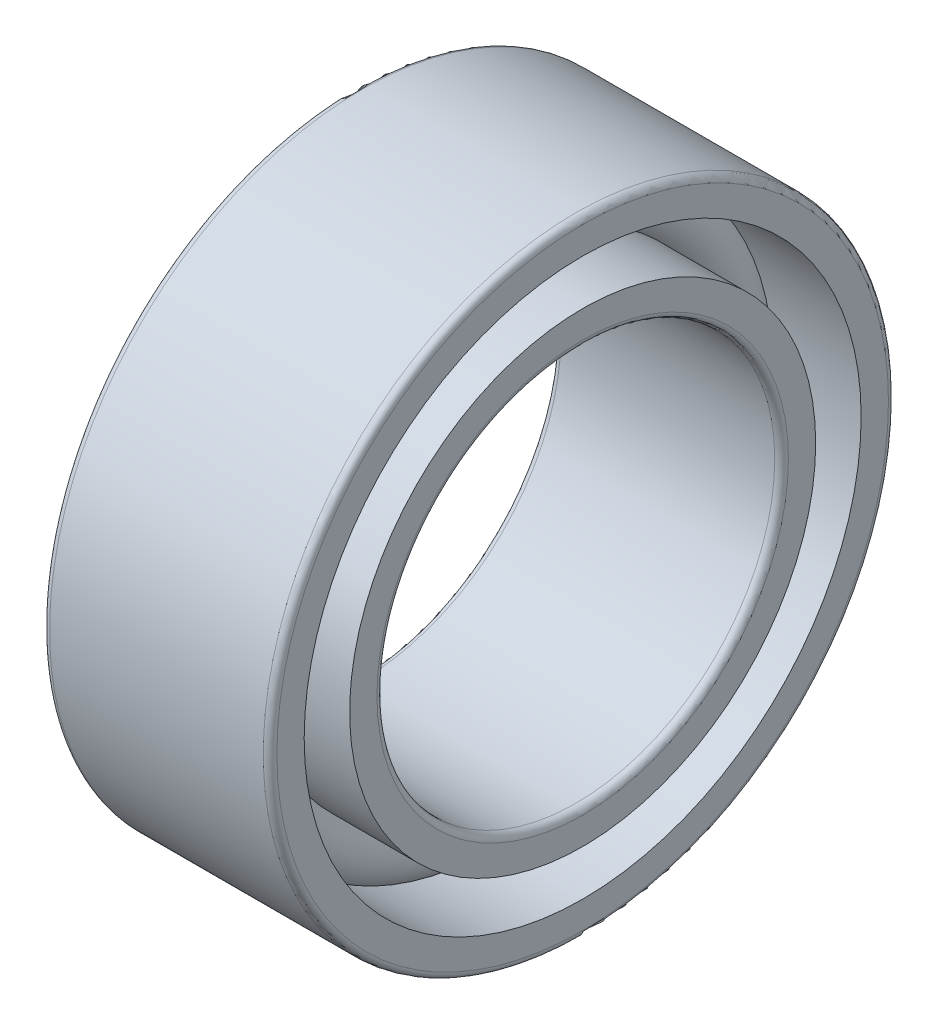
ISO-10303-21;
HEADER;
FILE_DESCRIPTION(('STEP AP214'),'2;1');
FILE_NAME('part.step','',(''),(''),'','','');
FILE_SCHEMA(('AUTOMOTIVE_DESIGN { 1 0 10303 214 1 1 1 1 }'));
ENDSEC;
DATA;
#1=APPLICATION_CONTEXT('core data for automotive mechanical design processes');
#2=APPLICATION_PROTOCOL_DEFINITION('international standard','automotive_design',2000,#1);
#3=PRODUCT_CONTEXT('',#1,'mechanical');
#4=PRODUCT('Part','Part','',(#3));
#5=PRODUCT_RELATED_PRODUCT_CATEGORY('part','',(#4));
#6=PRODUCT_DEFINITION_FORMATION('','',#4);
#7=PRODUCT_DEFINITION_CONTEXT('part definition',#1,'design');
#8=PRODUCT_DEFINITION('design','',#6,#7);
#9=PRODUCT_DEFINITION_SHAPE('','',#8);
#10=(LENGTH_UNIT() NAMED_UNIT(*) SI_UNIT(.MILLI.,.METRE.));
#11=(NAMED_UNIT(*) PLANE_ANGLE_UNIT() SI_UNIT($,.RADIAN.));
#12=(NAMED_UNIT(*) SI_UNIT($,.STERADIAN.) SOLID_ANGLE_UNIT());
#13=UNCERTAINTY_MEASURE_WITH_UNIT(LENGTH_MEASURE(1.E-05),#10,'distance_accuracy_value','');
#14=(GEOMETRIC_REPRESENTATION_CONTEXT(3) GLOBAL_UNCERTAINTY_ASSIGNED_CONTEXT((#13)) GLOBAL_UNIT_ASSIGNED_CONTEXT((#10,
#11,#12)) REPRESENTATION_CONTEXT('',''));
#15=CARTESIAN_POINT('',(0.,0.,0.));
#16=DIRECTION('',(0.,0.,1.));
#17=DIRECTION('',(1.,0.,0.));
#18=AXIS2_PLACEMENT_3D('',#15,#16,#17);
#19=CARTESIAN_POINT('',(-71.7913299491705,33.0370897872859,-24.0443986058399));
#20=DIRECTION('',(-1.,0.,0.));
#21=DIRECTION('',(0.,0.,1.));
#22=AXIS2_PLACEMENT_3D('',#19,#20,#21);
#23=TOROIDAL_SURFACE('',#22,22.5,3.);
#24=CARTESIAN_POINT('',(-69.5552619716707,33.0370897872859,-24.0443986058399));
#25=DIRECTION('',(-1.,0.,0.));
#26=DIRECTION('',(0.,0.,1.));
#27=AXIS2_PLACEMENT_3D('',#24,#25,#26);
#28=CIRCLE('',#27,24.5);
#29=CARTESIAN_POINT('',(-69.5552619716707,33.0370897872859,0.455601394160118));
#30=VERTEX_POINT('',#29);
#31=EDGE_CURVE('E39',#30,#30,#28,.F.);
#32=ORIENTED_EDGE('',*,*,#31,.T.);
#33=EDGE_LOOP('',(#32));
#34=FACE_BOUND('',#33,.T.);
#35=CARTESIAN_POINT('',(-69.5552619716707,33.0370897872859,-24.0443986058399));
#36=DIRECTION('',(-1.,0.,0.));
#37=DIRECTION('',(0.,0.,1.));
#38=AXIS2_PLACEMENT_3D('',#35,#36,#37);
#39=CIRCLE('',#38,20.5);
#40=CARTESIAN_POINT('',(-69.5552619716707,33.0370897872859,-3.54439860583988));
#41=VERTEX_POINT('',#40);
#42=EDGE_CURVE('E10',#41,#41,#39,.T.);
#43=ORIENTED_EDGE('',*,*,#42,.T.);
#44=EDGE_LOOP('',(#43));
#45=FACE_BOUND('',#44,.T.);
#46=ADVANCED_FACE('F35',(#34,#45),#23,.T.);
#47=CARTESIAN_POINT('',(-92.4288299491705,33.0370897872859,-24.0443986058399));
#48=DIRECTION('',(1.,0.,0.));
#49=DIRECTION('',(0.,0.,-1.));
#50=AXIS2_PLACEMENT_3D('',#47,#48,#49);
#51=CYLINDRICAL_SURFACE('',#50,20.5);
#52=CARTESIAN_POINT('',(-61.7913299491705,33.0370897872859,-24.0443986058399));
#53=DIRECTION('',(1.,0.,0.));
#54=DIRECTION('',(0.,0.,-1.));
#55=AXIS2_PLACEMENT_3D('',#52,#53,#54);
#56=CIRCLE('',#55,20.5);
#57=CARTESIAN_POINT('',(-61.7913299491705,33.0370897872859,-44.5443986058399));
#58=VERTEX_POINT('',#57);
#59=EDGE_CURVE('E48',#58,#58,#56,.T.);
#60=ORIENTED_EDGE('',*,*,#59,.F.);
#61=EDGE_LOOP('',(#60));
#62=FACE_BOUND('',#61,.T.);
#63=ORIENTED_EDGE('',*,*,#42,.F.);
#64=EDGE_LOOP('',(#63));
#65=FACE_BOUND('',#64,.T.);
#66=ADVANCED_FACE('F87',(#62,#65),#51,.T.);
#67=CARTESIAN_POINT('',(-92.4288299491705,33.0370897872859,-24.0443986058399));
#68=DIRECTION('',(1.,0.,0.));
#69=DIRECTION('',(0.,0.,-1.));
#70=AXIS2_PLACEMENT_3D('',#67,#68,#69);
#71=CYLINDRICAL_SURFACE('',#70,20.5);
#72=CARTESIAN_POINT('',(-81.7913299491705,33.0370897872859,-24.0443986058399));
#73=DIRECTION('',(1.,0.,0.));
#74=DIRECTION('',(0.,0.,-1.));
#75=AXIS2_PLACEMENT_3D('',#72,#73,#74);
#76=CIRCLE('',#75,20.5);
#77=CARTESIAN_POINT('',(-81.7913299491705,33.0370897872859,-44.5443986058399));
#78=VERTEX_POINT('',#77);
#79=EDGE_CURVE('E57',#78,#78,#76,.T.);
#80=ORIENTED_EDGE('',*,*,#79,.T.);
#81=EDGE_LOOP('',(#80));
#82=FACE_BOUND('',#81,.T.);
#83=CARTESIAN_POINT('',(-74.0273979266703,33.0370897872859,-24.0443986058399));
#84=DIRECTION('',(1.,0.,0.));
#85=DIRECTION('',(0.,0.,-1.));
#86=AXIS2_PLACEMENT_3D('',#83,#84,#85);
#87=CIRCLE('',#86,20.5);
#88=CARTESIAN_POINT('',(-74.0273979266703,33.0370897872859,-44.5443986058399));
#89=VERTEX_POINT('',#88);
#90=EDGE_CURVE('E43',#89,#89,#87,.T.);
#91=ORIENTED_EDGE('',*,*,#90,.F.);
#92=EDGE_LOOP('',(#91));
#93=FACE_BOUND('',#92,.T.);
#94=ADVANCED_FACE('F90',(#82,#93),#71,.T.);
#95=CARTESIAN_POINT('',(-61.7913299491705,51.1370897872859,-24.0443986058399));
#96=DIRECTION('',(1.,0.,0.));
#97=DIRECTION('',(0.,0.,-1.));
#98=AXIS2_PLACEMENT_3D('',#95,#96,#97);
#99=PLANE('',#98);
#100=ORIENTED_EDGE('',*,*,#59,.T.);
#101=EDGE_LOOP('',(#100));
#102=FACE_BOUND('',#101,.T.);
#103=CARTESIAN_POINT('',(-61.7913299491705,33.0370897872859,-24.0443986058399));
#104=DIRECTION('',(1.,0.,0.));
#105=DIRECTION('',(0.,0.,-1.));
#106=AXIS2_PLACEMENT_3D('',#103,#104,#105);
#107=CIRCLE('',#106,18.1);
#108=CARTESIAN_POINT('',(-61.7913299491705,33.0370897872859,-42.1443986058399));
#109=VERTEX_POINT('',#108);
#110=EDGE_CURVE('E79',#109,#109,#107,.T.);
#111=ORIENTED_EDGE('',*,*,#110,.F.);
#112=EDGE_LOOP('',(#111));
#113=FACE_BOUND('',#112,.T.);
#114=ADVANCED_FACE('F84',(#102,#113),#99,.T.);
#115=CARTESIAN_POINT('',(-62.3913299491705,33.0370897872859,-24.0443986058399));
#116=DIRECTION('',(1.,0.,0.));
#117=DIRECTION('',(0.,0.,-1.));
#118=AXIS2_PLACEMENT_3D('',#115,#116,#117);
#119=TOROIDAL_SURFACE('',#118,18.1,0.6);
#120=ORIENTED_EDGE('',*,*,#110,.T.);
#121=EDGE_LOOP('',(#120));
#122=FACE_BOUND('',#121,.T.);
#123=CARTESIAN_POINT('',(-62.3913299491705,33.0370897872859,-24.0443986058399));
#124=DIRECTION('',(1.,0.,0.));
#125=DIRECTION('',(0.,0.,-1.));
#126=AXIS2_PLACEMENT_3D('',#123,#124,#125);
#127=CIRCLE('',#126,17.5);
#128=CARTESIAN_POINT('',(-62.3913299491705,33.0370897872859,-41.5443986058399));
#129=VERTEX_POINT('',#128);
#130=EDGE_CURVE('E76',#129,#129,#127,.T.);
#131=ORIENTED_EDGE('',*,*,#130,.F.);
#132=EDGE_LOOP('',(#131));
#133=FACE_BOUND('',#132,.T.);
#134=ADVANCED_FACE('F101',(#122,#133),#119,.T.);
#135=CARTESIAN_POINT('',(-92.4288299491705,33.0370897872859,-24.0443986058399));
#136=DIRECTION('',(1.,0.,0.));
#137=DIRECTION('',(0.,0.,-1.));
#138=AXIS2_PLACEMENT_3D('',#135,#136,#137);
#139=CYLINDRICAL_SURFACE('',#138,17.5);
#140=ORIENTED_EDGE('',*,*,#130,.T.);
#141=EDGE_LOOP('',(#140));
#142=FACE_BOUND('',#141,.T.);
#143=CARTESIAN_POINT('',(-81.1913299491705,33.0370897872859,-24.0443986058399));
#144=DIRECTION('',(1.,0.,0.));
#145=DIRECTION('',(0.,0.,-1.));
#146=AXIS2_PLACEMENT_3D('',#143,#144,#145);
#147=CIRCLE('',#146,17.5);
#148=CARTESIAN_POINT('',(-81.1913299491705,33.0370897872859,-41.5443986058399));
#149=VERTEX_POINT('',#148);
#150=EDGE_CURVE('E73',#149,#149,#147,.T.);
#151=ORIENTED_EDGE('',*,*,#150,.F.);
#152=EDGE_LOOP('',(#151));
#153=FACE_BOUND('',#152,.T.);
#154=ADVANCED_FACE('F104',(#142,#153),#139,.F.);
#155=CARTESIAN_POINT('',(-81.1913299491705,33.0370897872859,-24.0443986058399));
#156=DIRECTION('',(1.,0.,0.));
#157=DIRECTION('',(0.,0.,-1.));
#158=AXIS2_PLACEMENT_3D('',#155,#156,#157);
#159=TOROIDAL_SURFACE('',#158,18.1,0.6);
#160=ORIENTED_EDGE('',*,*,#150,.T.);
#161=EDGE_LOOP('',(#160));
#162=FACE_BOUND('',#161,.T.);
#163=CARTESIAN_POINT('',(-81.7913299491705,33.0370897872859,-24.0443986058399));
#164=DIRECTION('',(1.,0.,0.));
#165=DIRECTION('',(0.,0.,-1.));
#166=AXIS2_PLACEMENT_3D('',#163,#164,#165);
#167=CIRCLE('',#166,18.1);
#168=CARTESIAN_POINT('',(-81.7913299491705,33.0370897872859,-42.1443986058399));
#169=VERTEX_POINT('',#168);
#170=EDGE_CURVE('E70',#169,#169,#167,.T.);
#171=ORIENTED_EDGE('',*,*,#170,.F.);
#172=EDGE_LOOP('',(#171));
#173=FACE_BOUND('',#172,.T.);
#174=ADVANCED_FACE('F108',(#162,#173),#159,.T.);
#175=CARTESIAN_POINT('',(-81.7913299491705,53.5370897872859,-24.0443986058399));
#176=DIRECTION('',(-1.,0.,0.));
#177=DIRECTION('',(0.,0.,1.));
#178=AXIS2_PLACEMENT_3D('',#175,#176,#177);
#179=PLANE('',#178);
#180=ORIENTED_EDGE('',*,*,#170,.T.);
#181=EDGE_LOOP('',(#180));
#182=FACE_BOUND('',#181,.T.);
#183=ORIENTED_EDGE('',*,*,#79,.F.);
#184=EDGE_LOOP('',(#183));
#185=FACE_BOUND('',#184,.T.);
#186=ADVANCED_FACE('F112',(#182,#185),#179,.T.);
#187=CARTESIAN_POINT('',(-74.0273979266703,33.0370897872859,-24.0443986058399));
#188=DIRECTION('',(1.,0.,0.));
#189=DIRECTION('',(0.,0.,-1.));
#190=AXIS2_PLACEMENT_3D('',#187,#188,#189);
#191=CIRCLE('',#190,24.5);
#192=CARTESIAN_POINT('',(-74.0273979266703,33.0370897872859,-48.5443986058399));
#193=VERTEX_POINT('',#192);
#194=EDGE_CURVE('E51',#193,#193,#191,.F.);
#195=ORIENTED_EDGE('',*,*,#194,.T.);
#196=EDGE_LOOP('',(#195));
#197=FACE_BOUND('',#196,.T.);
#198=ORIENTED_EDGE('',*,*,#90,.T.);
#199=EDGE_LOOP('',(#198));
#200=FACE_BOUND('',#199,.T.);
#201=ADVANCED_FACE('F37',(#197,#200),#23,.T.);
#202=CARTESIAN_POINT('',(-92.4288299491705,33.0370897872859,-24.0443986058399));
#203=DIRECTION('',(1.,0.,0.));
#204=DIRECTION('',(0.,0.,-1.));
#205=AXIS2_PLACEMENT_3D('',#202,#203,#204);
#206=CYLINDRICAL_SURFACE('',#205,24.5);
#207=CARTESIAN_POINT('',(-61.7913299491705,33.0370897872859,-24.0443986058399));
#208=DIRECTION('',(1.,0.,0.));
#209=DIRECTION('',(0.,0.,-1.));
#210=AXIS2_PLACEMENT_3D('',#207,#208,#209);
#211=CIRCLE('',#210,24.5);
#212=CARTESIAN_POINT('',(-61.7913299491705,33.0370897872859,-48.5443986058399));
#213=VERTEX_POINT('',#212);
#214=EDGE_CURVE('E53',#213,#213,#211,.T.);
#215=ORIENTED_EDGE('',*,*,#214,.T.);
#216=EDGE_LOOP('',(#215));
#217=FACE_BOUND('',#216,.T.);
#218=ORIENTED_EDGE('',*,*,#31,.F.);
#219=EDGE_LOOP('',(#218));
#220=FACE_BOUND('',#219,.T.);
#221=ADVANCED_FACE('F117',(#217,#220),#206,.F.);
#222=CARTESIAN_POINT('',(-92.4288299491705,33.0370897872859,-24.0443986058399));
#223=DIRECTION('',(1.,0.,0.));
#224=DIRECTION('',(0.,0.,-1.));
#225=AXIS2_PLACEMENT_3D('',#222,#223,#224);
#226=CYLINDRICAL_SURFACE('',#225,24.5);
#227=CARTESIAN_POINT('',(-81.7913299491705,33.0370897872859,-24.0443986058399));
#228=DIRECTION('',(1.,0.,0.));
#229=DIRECTION('',(0.,0.,-1.));
#230=AXIS2_PLACEMENT_3D('',#227,#228,#229);
#231=CIRCLE('',#230,24.5);
#232=CARTESIAN_POINT('',(-81.7913299491705,33.0370897872859,-48.5443986058399));
#233=VERTEX_POINT('',#232);
#234=EDGE_CURVE('E148',#233,#233,#231,.T.);
#235=ORIENTED_EDGE('',*,*,#234,.F.);
#236=EDGE_LOOP('',(#235));
#237=FACE_BOUND('',#236,.T.);
#238=ORIENTED_EDGE('',*,*,#194,.F.);
#239=EDGE_LOOP('',(#238));
#240=FACE_BOUND('',#239,.T.);
#241=ADVANCED_FACE('F120',(#237,#240),#226,.F.);
#242=CARTESIAN_POINT('',(-61.7913299491705,59.9370897872859,-24.0443986058399));
#243=DIRECTION('',(1.,0.,0.));
#244=DIRECTION('',(0.,0.,-1.));
#245=AXIS2_PLACEMENT_3D('',#242,#243,#244);
#246=PLANE('',#245);
#247=CARTESIAN_POINT('',(-61.7913299491705,33.0370897872859,-24.0443986058399));
#248=DIRECTION('',(1.,0.,0.));
#249=DIRECTION('',(0.,0.,-1.));
#250=AXIS2_PLACEMENT_3D('',#247,#248,#249);
#251=CIRCLE('',#250,26.9);
#252=CARTESIAN_POINT('',(-61.7913299491705,33.0370897872859,-50.9443986058399));
#253=VERTEX_POINT('',#252);
#254=EDGE_CURVE('E59',#253,#253,#251,.T.);
#255=ORIENTED_EDGE('',*,*,#254,.T.);
#256=EDGE_LOOP('',(#255));
#257=FACE_BOUND('',#256,.T.);
#258=ORIENTED_EDGE('',*,*,#214,.F.);
#259=EDGE_LOOP('',(#258));
#260=FACE_BOUND('',#259,.T.);
#261=ADVANCED_FACE('F121',(#257,#260),#246,.T.);
#262=CARTESIAN_POINT('',(-62.3913299491705,33.0370897872859,-24.0443986058399));
#263=DIRECTION('',(1.,0.,0.));
#264=DIRECTION('',(0.,0.,-1.));
#265=AXIS2_PLACEMENT_3D('',#262,#263,#264);
#266=TOROIDAL_SURFACE('',#265,26.9,0.599999999999997);
#267=CARTESIAN_POINT('',(-62.3913299491705,33.0370897872859,-24.0443986058399));
#268=DIRECTION('',(1.,0.,0.));
#269=DIRECTION('',(0.,0.,-1.));
#270=AXIS2_PLACEMENT_3D('',#267,#268,#269);
#271=CIRCLE('',#270,27.5);
#272=CARTESIAN_POINT('',(-62.3913299491705,33.0370897872859,-51.5443986058399));
#273=VERTEX_POINT('',#272);
#274=EDGE_CURVE('E64',#273,#273,#271,.T.);
#275=ORIENTED_EDGE('',*,*,#274,.T.);
#276=EDGE_LOOP('',(#275));
#277=FACE_BOUND('',#276,.T.);
#278=ORIENTED_EDGE('',*,*,#254,.F.);
#279=EDGE_LOOP('',(#278));
#280=FACE_BOUND('',#279,.T.);
#281=ADVANCED_FACE('F124',(#277,#280),#266,.T.);
#282=CARTESIAN_POINT('',(-92.4288299491705,33.0370897872859,-24.0443986058399));
#283=DIRECTION('',(1.,0.,0.));
#284=DIRECTION('',(0.,0.,-1.));
#285=AXIS2_PLACEMENT_3D('',#282,#283,#284);
#286=CYLINDRICAL_SURFACE('',#285,27.5);
#287=CARTESIAN_POINT('',(-81.1913299491705,33.0370897872859,-24.0443986058399));
#288=DIRECTION('',(1.,0.,0.));
#289=DIRECTION('',(0.,0.,-1.));
#290=AXIS2_PLACEMENT_3D('',#287,#288,#289);
#291=CIRCLE('',#290,27.5);
#292=CARTESIAN_POINT('',(-81.1913299491705,33.0370897872859,-51.5443986058399));
#293=VERTEX_POINT('',#292);
#294=EDGE_CURVE('E152',#293,#293,#291,.T.);
#295=ORIENTED_EDGE('',*,*,#294,.T.);
#296=EDGE_LOOP('',(#295));
#297=FACE_BOUND('',#296,.T.);
#298=ORIENTED_EDGE('',*,*,#274,.F.);
#299=EDGE_LOOP('',(#298));
#300=FACE_BOUND('',#299,.T.);
#301=ADVANCED_FACE('F128',(#297,#300),#286,.T.);
#302=CARTESIAN_POINT('',(-81.1913299491705,33.0370897872859,-24.0443986058399));
#303=DIRECTION('',(1.,0.,0.));
#304=DIRECTION('',(0.,0.,-1.));
#305=AXIS2_PLACEMENT_3D('',#302,#303,#304);
#306=TOROIDAL_SURFACE('',#305,26.9,0.599999999999997);
#307=CARTESIAN_POINT('',(-81.7913299491705,33.0370897872859,-24.0443986058399));
#308=DIRECTION('',(1.,0.,0.));
#309=DIRECTION('',(0.,0.,-1.));
#310=AXIS2_PLACEMENT_3D('',#307,#308,#309);
#311=CIRCLE('',#310,26.9);
#312=CARTESIAN_POINT('',(-81.7913299491705,33.0370897872859,-50.9443986058399));
#313=VERTEX_POINT('',#312);
#314=EDGE_CURVE('E149',#313,#313,#311,.T.);
#315=ORIENTED_EDGE('',*,*,#314,.T.);
#316=EDGE_LOOP('',(#315));
#317=FACE_BOUND('',#316,.T.);
#318=ORIENTED_EDGE('',*,*,#294,.F.);
#319=EDGE_LOOP('',(#318));
#320=FACE_BOUND('',#319,.T.);
#321=ADVANCED_FACE('F132',(#317,#320),#306,.T.);
#322=CARTESIAN_POINT('',(-81.7913299491705,57.5370897872859,-24.0443986058399));
#323=DIRECTION('',(-1.,0.,0.));
#324=DIRECTION('',(0.,0.,1.));
#325=AXIS2_PLACEMENT_3D('',#322,#323,#324);
#326=PLANE('',#325);
#327=ORIENTED_EDGE('',*,*,#234,.T.);
#328=EDGE_LOOP('',(#327));
#329=FACE_BOUND('',#328,.T.);
#330=ORIENTED_EDGE('',*,*,#314,.F.);
#331=EDGE_LOOP('',(#330));
#332=FACE_BOUND('',#331,.T.);
#333=ADVANCED_FACE('F136',(#329,#332),#326,.T.);
#334=CLOSED_SHELL('',(#46,#66,#94,#114,#134,#154,#174,#186,#201,#221,#241,#261,#281,#301,#321,#333));
#335=MANIFOLD_SOLID_BREP('B2',#334);
#336=ADVANCED_BREP_SHAPE_REPRESENTATION('',(#18,#335),#14);
#337=SHAPE_DEFINITION_REPRESENTATION(#9,#336);
ENDSEC;
END-ISO-10303-21;
